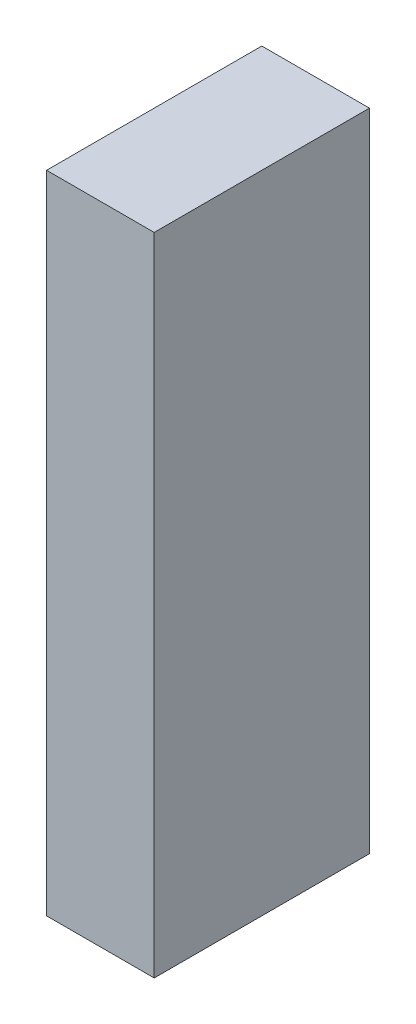
ISO-10303-21;
HEADER;
FILE_DESCRIPTION(('STEP AP214'),'2;1');
FILE_NAME('part.step','',(''),(''),'','','');
FILE_SCHEMA(('AUTOMOTIVE_DESIGN { 1 0 10303 214 1 1 1 1 }'));
ENDSEC;
DATA;
#1=APPLICATION_CONTEXT('core data for automotive mechanical design processes');
#2=APPLICATION_PROTOCOL_DEFINITION('international standard','automotive_design',2000,#1);
#3=PRODUCT_CONTEXT('',#1,'mechanical');
#4=PRODUCT('Part','Part','',(#3));
#5=PRODUCT_RELATED_PRODUCT_CATEGORY('part','',(#4));
#6=PRODUCT_DEFINITION_FORMATION('','',#4);
#7=PRODUCT_DEFINITION_CONTEXT('part definition',#1,'design');
#8=PRODUCT_DEFINITION('design','',#6,#7);
#9=PRODUCT_DEFINITION_SHAPE('','',#8);
#10=(LENGTH_UNIT() NAMED_UNIT(*) SI_UNIT(.MILLI.,.METRE.));
#11=(NAMED_UNIT(*) PLANE_ANGLE_UNIT() SI_UNIT($,.RADIAN.));
#12=(NAMED_UNIT(*) SI_UNIT($,.STERADIAN.) SOLID_ANGLE_UNIT());
#13=UNCERTAINTY_MEASURE_WITH_UNIT(LENGTH_MEASURE(1.E-05),#10,'distance_accuracy_value','');
#14=(GEOMETRIC_REPRESENTATION_CONTEXT(3) GLOBAL_UNCERTAINTY_ASSIGNED_CONTEXT((#13)) GLOBAL_UNIT_ASSIGNED_CONTEXT((#10,
#11,#12)) REPRESENTATION_CONTEXT('',''));
#15=CARTESIAN_POINT('',(0.,0.,0.));
#16=DIRECTION('',(0.,0.,1.));
#17=DIRECTION('',(1.,0.,0.));
#18=AXIS2_PLACEMENT_3D('',#15,#16,#17);
#19=CARTESIAN_POINT('',(19.05,57.15,-19.05));
#20=DIRECTION('',(0.,0.,1.));
#21=DIRECTION('',(0.,-1.,0.));
#22=AXIS2_PLACEMENT_3D('',#19,#20,#21);
#23=PLANE('',#22);
#24=DIRECTION('',(0.,1.,0.));
#25=VECTOR('',#24,1.);
#26=CARTESIAN_POINT('',(0.,57.15,-19.05));
#27=LINE('',#26,#25);
#28=CARTESIAN_POINT('',(0.,-57.15,-19.05));
#29=VERTEX_POINT('',#28);
#30=CARTESIAN_POINT('',(0.,57.15,-19.05));
#31=VERTEX_POINT('',#30);
#32=EDGE_CURVE('E102',#29,#31,#27,.T.);
#33=ORIENTED_EDGE('',*,*,#32,.T.);
#34=DIRECTION('',(-1.,0.,0.));
#35=VECTOR('',#34,1.);
#36=CARTESIAN_POINT('',(19.05,57.15,-19.05));
#37=LINE('',#36,#35);
#38=CARTESIAN_POINT('',(19.05,57.15,-19.05));
#39=VERTEX_POINT('',#38);
#40=EDGE_CURVE('E11',#39,#31,#37,.T.);
#41=ORIENTED_EDGE('',*,*,#40,.F.);
#42=DIRECTION('',(0.,1.,0.));
#43=VECTOR('',#42,1.);
#44=CARTESIAN_POINT('',(19.05,57.15,-19.05));
#45=LINE('',#44,#43);
#46=CARTESIAN_POINT('',(19.05,-57.15,-19.05));
#47=VERTEX_POINT('',#46);
#48=EDGE_CURVE('E95',#47,#39,#45,.T.);
#49=ORIENTED_EDGE('',*,*,#48,.F.);
#50=DIRECTION('',(-1.,0.,0.));
#51=VECTOR('',#50,1.);
#52=CARTESIAN_POINT('',(19.05,-57.15,-19.05));
#53=LINE('',#52,#51);
#54=EDGE_CURVE('E99',#47,#29,#53,.T.);
#55=ORIENTED_EDGE('',*,*,#54,.T.);
#56=EDGE_LOOP('',(#33,#41,#49,#55));
#57=FACE_BOUND('',#56,.T.);
#58=ADVANCED_FACE('F41',(#57),#23,.F.);
#59=CARTESIAN_POINT('',(19.05,57.15,19.05));
#60=DIRECTION('',(0.,-1.,0.));
#61=DIRECTION('',(0.,0.,-1.));
#62=AXIS2_PLACEMENT_3D('',#59,#60,#61);
#63=PLANE('',#62);
#64=DIRECTION('',(0.,0.,1.));
#65=VECTOR('',#64,1.);
#66=CARTESIAN_POINT('',(0.,57.15,19.05));
#67=LINE('',#66,#65);
#68=CARTESIAN_POINT('',(0.,57.15,19.05));
#69=VERTEX_POINT('',#68);
#70=EDGE_CURVE('E96',#31,#69,#67,.T.);
#71=ORIENTED_EDGE('',*,*,#70,.T.);
#72=DIRECTION('',(-1.,0.,0.));
#73=VECTOR('',#72,1.);
#74=CARTESIAN_POINT('',(19.05,57.15,19.05));
#75=LINE('',#74,#73);
#76=CARTESIAN_POINT('',(19.05,57.15,19.05));
#77=VERTEX_POINT('',#76);
#78=EDGE_CURVE('E47',#77,#69,#75,.T.);
#79=ORIENTED_EDGE('',*,*,#78,.F.);
#80=DIRECTION('',(0.,0.,1.));
#81=VECTOR('',#80,1.);
#82=CARTESIAN_POINT('',(19.05,57.15,19.05));
#83=LINE('',#82,#81);
#84=EDGE_CURVE('E87',#39,#77,#83,.T.);
#85=ORIENTED_EDGE('',*,*,#84,.F.);
#86=ORIENTED_EDGE('',*,*,#40,.T.);
#87=EDGE_LOOP('',(#71,#79,#85,#86));
#88=FACE_BOUND('',#87,.T.);
#89=ADVANCED_FACE('F92',(#88),#63,.F.);
#90=CARTESIAN_POINT('',(19.05,57.15,19.05));
#91=DIRECTION('',(0.,0.,-1.));
#92=DIRECTION('',(0.,1.,0.));
#93=AXIS2_PLACEMENT_3D('',#90,#91,#92);
#94=PLANE('',#93);
#95=DIRECTION('',(0.,-1.,0.));
#96=VECTOR('',#95,1.);
#97=CARTESIAN_POINT('',(0.,57.15,19.05));
#98=LINE('',#97,#96);
#99=CARTESIAN_POINT('',(0.,-57.15,19.05));
#100=VERTEX_POINT('',#99);
#101=EDGE_CURVE('E74',#69,#100,#98,.T.);
#102=ORIENTED_EDGE('',*,*,#101,.T.);
#103=DIRECTION('',(-1.,0.,0.));
#104=VECTOR('',#103,1.);
#105=CARTESIAN_POINT('',(19.05,-57.15,19.05));
#106=LINE('',#105,#104);
#107=CARTESIAN_POINT('',(19.05,-57.15,19.05));
#108=VERTEX_POINT('',#107);
#109=EDGE_CURVE('E100',#108,#100,#106,.T.);
#110=ORIENTED_EDGE('',*,*,#109,.F.);
#111=DIRECTION('',(0.,-1.,0.));
#112=VECTOR('',#111,1.);
#113=CARTESIAN_POINT('',(19.05,57.15,19.05));
#114=LINE('',#113,#112);
#115=EDGE_CURVE('E89',#77,#108,#114,.T.);
#116=ORIENTED_EDGE('',*,*,#115,.F.);
#117=ORIENTED_EDGE('',*,*,#78,.T.);
#118=EDGE_LOOP('',(#102,#110,#116,#117));
#119=FACE_BOUND('',#118,.T.);
#120=ADVANCED_FACE('F98',(#119),#94,.F.);
#121=CARTESIAN_POINT('',(19.05,-57.15,19.05));
#122=DIRECTION('',(0.,1.,0.));
#123=DIRECTION('',(0.,0.,1.));
#124=AXIS2_PLACEMENT_3D('',#121,#122,#123);
#125=PLANE('',#124);
#126=DIRECTION('',(0.,0.,-1.));
#127=VECTOR('',#126,1.);
#128=CARTESIAN_POINT('',(0.,-57.15,19.05));
#129=LINE('',#128,#127);
#130=EDGE_CURVE('E80',#100,#29,#129,.T.);
#131=ORIENTED_EDGE('',*,*,#130,.T.);
#132=ORIENTED_EDGE('',*,*,#54,.F.);
#133=DIRECTION('',(0.,0.,-1.));
#134=VECTOR('',#133,1.);
#135=CARTESIAN_POINT('',(19.05,-57.15,19.05));
#136=LINE('',#135,#134);
#137=EDGE_CURVE('E60',#108,#47,#136,.T.);
#138=ORIENTED_EDGE('',*,*,#137,.F.);
#139=ORIENTED_EDGE('',*,*,#109,.T.);
#140=EDGE_LOOP('',(#131,#132,#138,#139));
#141=FACE_BOUND('',#140,.T.);
#142=ADVANCED_FACE('F112',(#141),#125,.F.);
#143=CARTESIAN_POINT('',(19.05,0.,0.));
#144=DIRECTION('',(1.,0.,0.));
#145=DIRECTION('',(0.,0.,-1.));
#146=AXIS2_PLACEMENT_3D('',#143,#144,#145);
#147=PLANE('',#146);
#148=ORIENTED_EDGE('',*,*,#48,.T.);
#149=ORIENTED_EDGE('',*,*,#84,.T.);
#150=ORIENTED_EDGE('',*,*,#115,.T.);
#151=ORIENTED_EDGE('',*,*,#137,.T.);
#152=EDGE_LOOP('',(#148,#149,#150,#151));
#153=FACE_BOUND('',#152,.T.);
#154=ADVANCED_FACE('F86',(#153),#147,.T.);
#155=CARTESIAN_POINT('',(0.,0.,0.));
#156=DIRECTION('',(1.,0.,0.));
#157=DIRECTION('',(0.,0.,-1.));
#158=AXIS2_PLACEMENT_3D('',#155,#156,#157);
#159=PLANE('',#158);
#160=ORIENTED_EDGE('',*,*,#32,.F.);
#161=ORIENTED_EDGE('',*,*,#130,.F.);
#162=ORIENTED_EDGE('',*,*,#101,.F.);
#163=ORIENTED_EDGE('',*,*,#70,.F.);
#164=EDGE_LOOP('',(#160,#161,#162,#163));
#165=FACE_BOUND('',#164,.T.);
#166=ADVANCED_FACE('F111',(#165),#159,.F.);
#167=CLOSED_SHELL('',(#58,#89,#120,#142,#154,#166));
#168=MANIFOLD_SOLID_BREP('B2',#167);
#169=ADVANCED_BREP_SHAPE_REPRESENTATION('',(#18,#168),#14);
#170=SHAPE_DEFINITION_REPRESENTATION(#9,#169);
ENDSEC;
END-ISO-10303-21;
